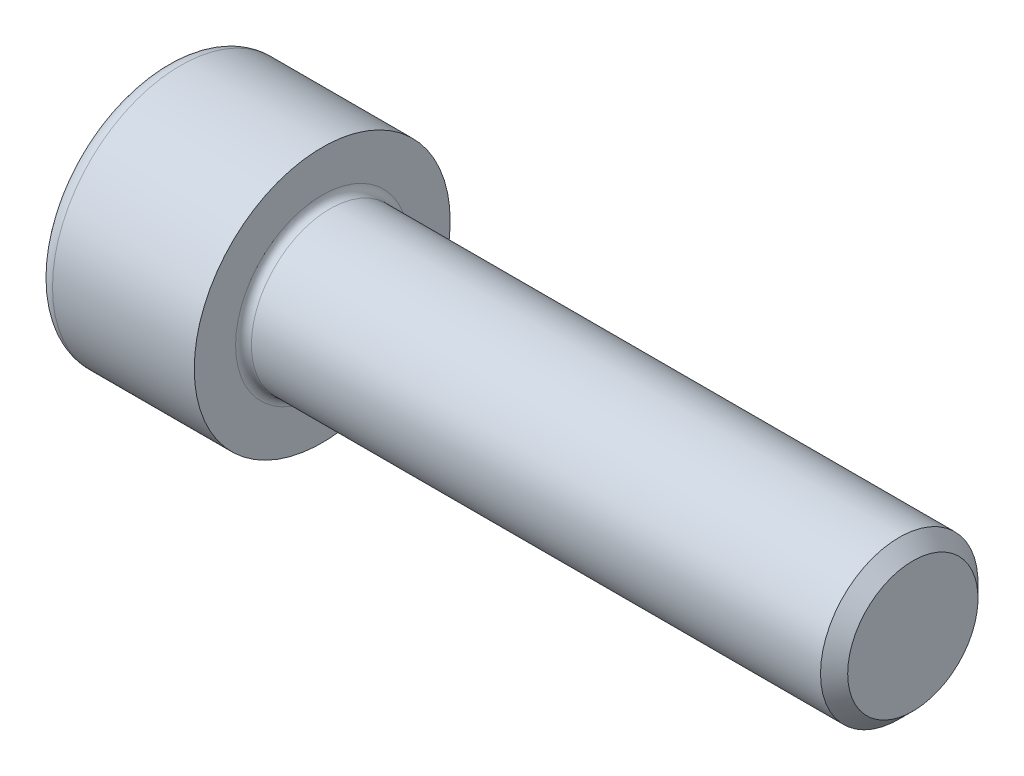
ISO-10303-21;
HEADER;
FILE_DESCRIPTION(('STEP AP214'),'2;1');
FILE_NAME('part.step','',(''),(''),'','','');
FILE_SCHEMA(('AUTOMOTIVE_DESIGN { 1 0 10303 214 1 1 1 1 }'));
ENDSEC;
DATA;
#1=APPLICATION_CONTEXT('core data for automotive mechanical design processes');
#2=APPLICATION_PROTOCOL_DEFINITION('international standard','automotive_design',2000,#1);
#3=PRODUCT_CONTEXT('',#1,'mechanical');
#4=PRODUCT('Part','Part','',(#3));
#5=PRODUCT_RELATED_PRODUCT_CATEGORY('part','',(#4));
#6=PRODUCT_DEFINITION_FORMATION('','',#4);
#7=PRODUCT_DEFINITION_CONTEXT('part definition',#1,'design');
#8=PRODUCT_DEFINITION('design','',#6,#7);
#9=PRODUCT_DEFINITION_SHAPE('','',#8);
#10=(LENGTH_UNIT() NAMED_UNIT(*) SI_UNIT(.MILLI.,.METRE.));
#11=(NAMED_UNIT(*) PLANE_ANGLE_UNIT() SI_UNIT($,.RADIAN.));
#12=(NAMED_UNIT(*) SI_UNIT($,.STERADIAN.) SOLID_ANGLE_UNIT());
#13=UNCERTAINTY_MEASURE_WITH_UNIT(LENGTH_MEASURE(1.E-05),#10,'distance_accuracy_value','');
#14=(GEOMETRIC_REPRESENTATION_CONTEXT(3) GLOBAL_UNCERTAINTY_ASSIGNED_CONTEXT((#13)) GLOBAL_UNIT_ASSIGNED_CONTEXT((#10,
#11,#12)) REPRESENTATION_CONTEXT('',''));
#15=CARTESIAN_POINT('',(0.,0.,0.));
#16=DIRECTION('',(0.,0.,1.));
#17=DIRECTION('',(1.,0.,0.));
#18=AXIS2_PLACEMENT_3D('',#15,#16,#17);
#19=CARTESIAN_POINT('',(3.99999999996226,0.,0.));
#20=DIRECTION('',(-1.,0.,0.));
#21=DIRECTION('',(0.,0.,1.));
#22=AXIS2_PLACEMENT_3D('',#19,#20,#21);
#23=CONICAL_SURFACE('',#22,3.00999999996066,1.04719755119748);
#24=CARTESIAN_POINT('',(5.73782431018799,0.,0.));
#25=VERTEX_POINT('',#24);
#26=VERTEX_LOOP('',#25);
#27=FACE_BOUND('',#26,.T.);
#28=CARTESIAN_POINT('',(3.99999999996226,0.,0.));
#29=DIRECTION('',(-1.,0.,0.));
#30=DIRECTION('',(0.,0.,1.));
#31=AXIS2_PLACEMENT_3D('',#28,#29,#30);
#32=CIRCLE('',#31,3.00999999996066);
#33=CARTESIAN_POINT('',(3.99999999998113,-2.60673646537412,1.50499999999017));
#34=VERTEX_POINT('',#33);
#35=CARTESIAN_POINT('',(3.99999999995748,0.,3.00999999999891));
#36=VERTEX_POINT('',#35);
#37=EDGE_CURVE('E102',#34,#36,#32,.T.);
#38=ORIENTED_EDGE('',*,*,#37,.T.);
#39=CARTESIAN_POINT('',(3.99999999996226,0.,0.));
#40=DIRECTION('',(-1.,0.,0.));
#41=DIRECTION('',(0.,0.,1.));
#42=AXIS2_PLACEMENT_3D('',#39,#40,#41);
#43=CIRCLE('',#42,3.00999999996066);
#44=CARTESIAN_POINT('',(3.99999999998113,2.60673646537412,1.50499999999016));
#45=VERTEX_POINT('',#44);
#46=EDGE_CURVE('E105',#36,#45,#43,.T.);
#47=ORIENTED_EDGE('',*,*,#46,.T.);
#48=CARTESIAN_POINT('',(3.99999999996226,0.,0.));
#49=DIRECTION('',(-1.,0.,0.));
#50=DIRECTION('',(0.,0.,1.));
#51=AXIS2_PLACEMENT_3D('',#48,#49,#50);
#52=CIRCLE('',#51,3.00999999996066);
#53=CARTESIAN_POINT('',(3.99999999998113,2.60673646537412,-1.50499999999017));
#54=VERTEX_POINT('',#53);
#55=EDGE_CURVE('E107',#45,#54,#52,.T.);
#56=ORIENTED_EDGE('',*,*,#55,.T.);
#57=CARTESIAN_POINT('',(3.99999999996226,0.,0.));
#58=DIRECTION('',(-1.,0.,0.));
#59=DIRECTION('',(0.,0.,1.));
#60=AXIS2_PLACEMENT_3D('',#57,#58,#59);
#61=CIRCLE('',#60,3.00999999996066);
#62=CARTESIAN_POINT('',(3.99999999995748,0.,-3.00999999999891));
#63=VERTEX_POINT('',#62);
#64=EDGE_CURVE('E121',#54,#63,#61,.T.);
#65=ORIENTED_EDGE('',*,*,#64,.T.);
#66=CARTESIAN_POINT('',(3.99999999996226,0.,0.));
#67=DIRECTION('',(-1.,0.,0.));
#68=DIRECTION('',(0.,0.,1.));
#69=AXIS2_PLACEMENT_3D('',#66,#67,#68);
#70=CIRCLE('',#69,3.00999999996065);
#71=CARTESIAN_POINT('',(3.99999999998113,-2.60673646537413,-1.50499999999016));
#72=VERTEX_POINT('',#71);
#73=EDGE_CURVE('E122',#63,#72,#70,.T.);
#74=ORIENTED_EDGE('',*,*,#73,.T.);
#75=CARTESIAN_POINT('',(3.99999999996226,0.,0.));
#76=DIRECTION('',(-1.,0.,0.));
#77=DIRECTION('',(0.,0.,1.));
#78=AXIS2_PLACEMENT_3D('',#75,#76,#77);
#79=CIRCLE('',#78,3.00999999996066);
#80=EDGE_CURVE('E230',#72,#34,#79,.T.);
#81=ORIENTED_EDGE('',*,*,#80,.T.);
#82=EDGE_LOOP('',(#38,#47,#56,#65,#74,#81));
#83=FACE_BOUND('',#82,.T.);
#84=ADVANCED_FACE('F17',(#27,#83),#23,.F.);
#85=CARTESIAN_POINT('',(4.,3.47564862052154,0.));
#86=DIRECTION('',(1.,0.,0.));
#87=DIRECTION('',(0.,0.,-1.));
#88=AXIS2_PLACEMENT_3D('',#85,#86,#87);
#89=PLANE('',#88);
#90=DIRECTION('',(0.,0.499999999999999,-0.866025403784439));
#91=VECTOR('',#90,1.);
#92=CARTESIAN_POINT('',(4.,3.47564862052154,0.));
#93=LINE('',#92,#91);
#94=CARTESIAN_POINT('',(4.,1.73782431026077,3.01));
#95=VERTEX_POINT('',#94);
#96=EDGE_CURVE('E125',#45,#95,#93,.F.);
#97=ORIENTED_EDGE('',*,*,#96,.F.);
#98=ORIENTED_EDGE('',*,*,#46,.F.);
#99=DIRECTION('',(0.,-1.,0.));
#100=VECTOR('',#99,1.);
#101=CARTESIAN_POINT('',(4.,-1.73782431026077,3.01));
#102=LINE('',#101,#100);
#103=EDGE_CURVE('E127',#36,#95,#102,.F.);
#104=ORIENTED_EDGE('',*,*,#103,.T.);
#105=EDGE_LOOP('',(#97,#98,#104));
#106=FACE_BOUND('',#105,.T.);
#107=ADVANCED_FACE('F126',(#106),#89,.F.);
#108=CARTESIAN_POINT('',(4.,3.47564862052154,0.));
#109=DIRECTION('',(1.,0.,0.));
#110=DIRECTION('',(0.,0.,-1.));
#111=AXIS2_PLACEMENT_3D('',#108,#109,#110);
#112=PLANE('',#111);
#113=DIRECTION('',(0.,-1.,0.));
#114=VECTOR('',#113,1.);
#115=CARTESIAN_POINT('',(4.,-1.73782431026077,3.01));
#116=LINE('',#115,#114);
#117=CARTESIAN_POINT('',(4.,-1.73782431026077,3.01));
#118=VERTEX_POINT('',#117);
#119=EDGE_CURVE('E130',#118,#36,#116,.F.);
#120=ORIENTED_EDGE('',*,*,#119,.T.);
#121=ORIENTED_EDGE('',*,*,#37,.F.);
#122=DIRECTION('',(0.,0.500000000000001,0.866025403784438));
#123=VECTOR('',#122,1.);
#124=CARTESIAN_POINT('',(4.,-1.73782431026077,3.01));
#125=LINE('',#124,#123);
#126=EDGE_CURVE('E183',#118,#34,#125,.F.);
#127=ORIENTED_EDGE('',*,*,#126,.F.);
#128=EDGE_LOOP('',(#120,#121,#127));
#129=FACE_BOUND('',#128,.T.);
#130=ADVANCED_FACE('F490',(#129),#112,.F.);
#131=CARTESIAN_POINT('',(4.,3.47564862052154,0.));
#132=DIRECTION('',(1.,0.,0.));
#133=DIRECTION('',(0.,0.,-1.));
#134=AXIS2_PLACEMENT_3D('',#131,#132,#133);
#135=PLANE('',#134);
#136=DIRECTION('',(0.,0.500000000000001,0.866025403784438));
#137=VECTOR('',#136,1.);
#138=CARTESIAN_POINT('',(4.,-1.73782431026077,3.01));
#139=LINE('',#138,#137);
#140=CARTESIAN_POINT('',(4.,-3.47564862052155,0.));
#141=VERTEX_POINT('',#140);
#142=EDGE_CURVE('E179',#34,#141,#139,.F.);
#143=ORIENTED_EDGE('',*,*,#142,.F.);
#144=ORIENTED_EDGE('',*,*,#80,.F.);
#145=DIRECTION('',(0.,-0.499999999999999,0.866025403784439));
#146=VECTOR('',#145,1.);
#147=CARTESIAN_POINT('',(4.,-3.47564862052155,0.));
#148=LINE('',#147,#146);
#149=EDGE_CURVE('E166',#141,#72,#148,.F.);
#150=ORIENTED_EDGE('',*,*,#149,.F.);
#151=EDGE_LOOP('',(#143,#144,#150));
#152=FACE_BOUND('',#151,.T.);
#153=ADVANCED_FACE('F482',(#152),#135,.F.);
#154=CARTESIAN_POINT('',(4.,3.47564862052154,0.));
#155=DIRECTION('',(1.,0.,0.));
#156=DIRECTION('',(0.,0.,-1.));
#157=AXIS2_PLACEMENT_3D('',#154,#155,#156);
#158=PLANE('',#157);
#159=DIRECTION('',(0.,-0.499999999999999,0.866025403784439));
#160=VECTOR('',#159,1.);
#161=CARTESIAN_POINT('',(4.,-3.47564862052155,0.));
#162=LINE('',#161,#160);
#163=CARTESIAN_POINT('',(4.,-1.73782431026078,-3.01));
#164=VERTEX_POINT('',#163);
#165=EDGE_CURVE('E163',#72,#164,#162,.F.);
#166=ORIENTED_EDGE('',*,*,#165,.F.);
#167=ORIENTED_EDGE('',*,*,#73,.F.);
#168=DIRECTION('',(0.,1.,0.));
#169=VECTOR('',#168,1.);
#170=CARTESIAN_POINT('',(4.,1.73782431026076,-3.01));
#171=LINE('',#170,#169);
#172=EDGE_CURVE('E157',#63,#164,#171,.F.);
#173=ORIENTED_EDGE('',*,*,#172,.T.);
#174=EDGE_LOOP('',(#166,#167,#173));
#175=FACE_BOUND('',#174,.T.);
#176=ADVANCED_FACE('F475',(#175),#158,.F.);
#177=CARTESIAN_POINT('',(4.,3.47564862052154,0.));
#178=DIRECTION('',(1.,0.,0.));
#179=DIRECTION('',(0.,0.,-1.));
#180=AXIS2_PLACEMENT_3D('',#177,#178,#179);
#181=PLANE('',#180);
#182=DIRECTION('',(0.,0.500000000000001,0.866025403784438));
#183=VECTOR('',#182,1.);
#184=CARTESIAN_POINT('',(4.,3.47564862052154,0.));
#185=LINE('',#184,#183);
#186=CARTESIAN_POINT('',(4.,3.47564862052154,0.));
#187=VERTEX_POINT('',#186);
#188=EDGE_CURVE('E119',#187,#54,#185,.F.);
#189=ORIENTED_EDGE('',*,*,#188,.T.);
#190=ORIENTED_EDGE('',*,*,#55,.F.);
#191=DIRECTION('',(0.,0.499999999999999,-0.866025403784439));
#192=VECTOR('',#191,1.);
#193=CARTESIAN_POINT('',(4.,3.47564862052154,0.));
#194=LINE('',#193,#192);
#195=EDGE_CURVE('E116',#187,#45,#194,.F.);
#196=ORIENTED_EDGE('',*,*,#195,.F.);
#197=EDGE_LOOP('',(#189,#190,#196));
#198=FACE_BOUND('',#197,.T.);
#199=ADVANCED_FACE('F114',(#198),#181,.F.);
#200=CARTESIAN_POINT('',(4.,3.47564862052154,0.));
#201=DIRECTION('',(1.,0.,0.));
#202=DIRECTION('',(0.,0.,-1.));
#203=AXIS2_PLACEMENT_3D('',#200,#201,#202);
#204=PLANE('',#203);
#205=DIRECTION('',(0.,1.,0.));
#206=VECTOR('',#205,1.);
#207=CARTESIAN_POINT('',(4.,1.73782431026076,-3.01));
#208=LINE('',#207,#206);
#209=CARTESIAN_POINT('',(4.,1.73782431026077,-3.01));
#210=VERTEX_POINT('',#209);
#211=EDGE_CURVE('E160',#210,#63,#208,.F.);
#212=ORIENTED_EDGE('',*,*,#211,.T.);
#213=ORIENTED_EDGE('',*,*,#64,.F.);
#214=DIRECTION('',(0.,0.500000000000001,0.866025403784438));
#215=VECTOR('',#214,1.);
#216=CARTESIAN_POINT('',(4.,3.47564862052154,0.));
#217=LINE('',#216,#215);
#218=EDGE_CURVE('E317',#54,#210,#217,.F.);
#219=ORIENTED_EDGE('',*,*,#218,.T.);
#220=EDGE_LOOP('',(#212,#213,#219));
#221=FACE_BOUND('',#220,.T.);
#222=ADVANCED_FACE('F461',(#221),#204,.F.);
#223=CARTESIAN_POINT('',(4.,3.47564862052154,0.));
#224=DIRECTION('',(0.,-0.866025403784439,-0.499999999999999));
#225=DIRECTION('',(0.,0.499999999999999,-0.866025403784439));
#226=AXIS2_PLACEMENT_3D('',#223,#224,#225);
#227=PLANE('',#226);
#228=ORIENTED_EDGE('',*,*,#96,.T.);
#229=DIRECTION('',(1.,0.,0.));
#230=VECTOR('',#229,1.);
#231=CARTESIAN_POINT('',(4.,1.73782431026077,3.01));
#232=LINE('',#231,#230);
#233=CARTESIAN_POINT('',(0.,1.73782431026077,3.01));
#234=VERTEX_POINT('',#233);
#235=EDGE_CURVE('E203',#95,#234,#232,.F.);
#236=ORIENTED_EDGE('',*,*,#235,.T.);
#237=DIRECTION('',(0.,-0.499999999999999,0.866025403784439));
#238=VECTOR('',#237,1.);
#239=CARTESIAN_POINT('',(0.,3.47564862052154,0.));
#240=LINE('',#239,#238);
#241=CARTESIAN_POINT('',(0.,3.47564862052154,0.));
#242=VERTEX_POINT('',#241);
#243=EDGE_CURVE('E143',#242,#234,#240,.T.);
#244=ORIENTED_EDGE('',*,*,#243,.F.);
#245=DIRECTION('',(1.,0.,0.));
#246=VECTOR('',#245,1.);
#247=CARTESIAN_POINT('',(4.,3.47564862052154,0.));
#248=LINE('',#247,#246);
#249=EDGE_CURVE('E134',#242,#187,#248,.T.);
#250=ORIENTED_EDGE('',*,*,#249,.T.);
#251=ORIENTED_EDGE('',*,*,#195,.T.);
#252=EDGE_LOOP('',(#228,#236,#244,#250,#251));
#253=FACE_BOUND('',#252,.T.);
#254=ADVANCED_FACE('F132',(#253),#227,.T.);
#255=CARTESIAN_POINT('',(4.,-1.73782431026077,3.01));
#256=DIRECTION('',(0.,0.,1.));
#257=DIRECTION('',(0.,-1.,0.));
#258=AXIS2_PLACEMENT_3D('',#255,#256,#257);
#259=PLANE('',#258);
#260=ORIENTED_EDGE('',*,*,#235,.F.);
#261=ORIENTED_EDGE('',*,*,#103,.F.);
#262=ORIENTED_EDGE('',*,*,#119,.F.);
#263=DIRECTION('',(1.,0.,0.));
#264=VECTOR('',#263,1.);
#265=CARTESIAN_POINT('',(4.,-1.73782431026077,3.01));
#266=LINE('',#265,#264);
#267=CARTESIAN_POINT('',(0.,-1.73782431026077,3.01));
#268=VERTEX_POINT('',#267);
#269=EDGE_CURVE('E198',#268,#118,#266,.T.);
#270=ORIENTED_EDGE('',*,*,#269,.F.);
#271=DIRECTION('',(0.,1.,0.));
#272=VECTOR('',#271,1.);
#273=CARTESIAN_POINT('',(0.,0.,3.01));
#274=LINE('',#273,#272);
#275=EDGE_CURVE('E146',#234,#268,#274,.F.);
#276=ORIENTED_EDGE('',*,*,#275,.F.);
#277=EDGE_LOOP('',(#260,#261,#262,#270,#276));
#278=FACE_BOUND('',#277,.T.);
#279=ADVANCED_FACE('F446',(#278),#259,.F.);
#280=CARTESIAN_POINT('',(4.,-1.73782431026077,3.01));
#281=DIRECTION('',(0.,0.866025403784438,-0.500000000000001));
#282=DIRECTION('',(0.,0.500000000000001,0.866025403784438));
#283=AXIS2_PLACEMENT_3D('',#280,#281,#282);
#284=PLANE('',#283);
#285=ORIENTED_EDGE('',*,*,#142,.T.);
#286=DIRECTION('',(1.,0.,0.));
#287=VECTOR('',#286,1.);
#288=CARTESIAN_POINT('',(4.,-3.47564862052155,0.));
#289=LINE('',#288,#287);
#290=CARTESIAN_POINT('',(0.,-3.47564862052155,0.));
#291=VERTEX_POINT('',#290);
#292=EDGE_CURVE('E174',#291,#141,#289,.T.);
#293=ORIENTED_EDGE('',*,*,#292,.F.);
#294=DIRECTION('',(0.,-0.500000000000001,-0.866025403784438));
#295=VECTOR('',#294,1.);
#296=CARTESIAN_POINT('',(0.,-1.73782431026077,3.01));
#297=LINE('',#296,#295);
#298=EDGE_CURVE('E189',#268,#291,#297,.T.);
#299=ORIENTED_EDGE('',*,*,#298,.F.);
#300=ORIENTED_EDGE('',*,*,#269,.T.);
#301=ORIENTED_EDGE('',*,*,#126,.T.);
#302=EDGE_LOOP('',(#285,#293,#299,#300,#301));
#303=FACE_BOUND('',#302,.T.);
#304=ADVANCED_FACE('F438',(#303),#284,.T.);
#305=CARTESIAN_POINT('',(4.,-3.47564862052155,0.));
#306=DIRECTION('',(0.,0.866025403784439,0.499999999999999));
#307=DIRECTION('',(0.,-0.499999999999999,0.866025403784439));
#308=AXIS2_PLACEMENT_3D('',#305,#306,#307);
#309=PLANE('',#308);
#310=ORIENTED_EDGE('',*,*,#165,.T.);
#311=DIRECTION('',(1.,0.,0.));
#312=VECTOR('',#311,1.);
#313=CARTESIAN_POINT('',(4.,-1.73782431026078,-3.01));
#314=LINE('',#313,#312);
#315=CARTESIAN_POINT('',(0.,-1.73782431026078,-3.01));
#316=VERTEX_POINT('',#315);
#317=EDGE_CURVE('E159',#164,#316,#314,.F.);
#318=ORIENTED_EDGE('',*,*,#317,.T.);
#319=DIRECTION('',(0.,0.499999999999999,-0.866025403784439));
#320=VECTOR('',#319,1.);
#321=CARTESIAN_POINT('',(0.,-3.47564862052155,0.));
#322=LINE('',#321,#320);
#323=EDGE_CURVE('E186',#291,#316,#322,.T.);
#324=ORIENTED_EDGE('',*,*,#323,.F.);
#325=ORIENTED_EDGE('',*,*,#292,.T.);
#326=ORIENTED_EDGE('',*,*,#149,.T.);
#327=EDGE_LOOP('',(#310,#318,#324,#325,#326));
#328=FACE_BOUND('',#327,.T.);
#329=ADVANCED_FACE('F431',(#328),#309,.T.);
#330=CARTESIAN_POINT('',(4.,1.73782431026076,-3.01));
#331=DIRECTION('',(0.,0.,-1.));
#332=DIRECTION('',(0.,1.,0.));
#333=AXIS2_PLACEMENT_3D('',#330,#331,#332);
#334=PLANE('',#333);
#335=ORIENTED_EDGE('',*,*,#317,.F.);
#336=ORIENTED_EDGE('',*,*,#172,.F.);
#337=ORIENTED_EDGE('',*,*,#211,.F.);
#338=DIRECTION('',(1.,0.,0.));
#339=VECTOR('',#338,1.);
#340=CARTESIAN_POINT('',(4.,1.73782431026076,-3.01));
#341=LINE('',#340,#339);
#342=CARTESIAN_POINT('',(0.,1.73782431026077,-3.01));
#343=VERTEX_POINT('',#342);
#344=EDGE_CURVE('E147',#210,#343,#341,.F.);
#345=ORIENTED_EDGE('',*,*,#344,.T.);
#346=DIRECTION('',(0.,1.,0.));
#347=VECTOR('',#346,1.);
#348=CARTESIAN_POINT('',(0.,0.,-3.01));
#349=LINE('',#348,#347);
#350=EDGE_CURVE('E154',#316,#343,#349,.T.);
#351=ORIENTED_EDGE('',*,*,#350,.F.);
#352=EDGE_LOOP('',(#335,#336,#337,#345,#351));
#353=FACE_BOUND('',#352,.T.);
#354=ADVANCED_FACE('F335',(#353),#334,.F.);
#355=CARTESIAN_POINT('',(4.,3.47564862052154,0.));
#356=DIRECTION('',(0.,0.866025403784438,-0.500000000000001));
#357=DIRECTION('',(0.,0.500000000000001,0.866025403784438));
#358=AXIS2_PLACEMENT_3D('',#355,#356,#357);
#359=PLANE('',#358);
#360=ORIENTED_EDGE('',*,*,#344,.F.);
#361=ORIENTED_EDGE('',*,*,#218,.F.);
#362=ORIENTED_EDGE('',*,*,#188,.F.);
#363=ORIENTED_EDGE('',*,*,#249,.F.);
#364=DIRECTION('',(0.,0.500000000000001,0.866025403784438));
#365=VECTOR('',#364,1.);
#366=CARTESIAN_POINT('',(0.,1.73782431026076,-3.01));
#367=LINE('',#366,#365);
#368=EDGE_CURVE('E150',#343,#242,#367,.T.);
#369=ORIENTED_EDGE('',*,*,#368,.F.);
#370=EDGE_LOOP('',(#360,#361,#362,#363,#369));
#371=FACE_BOUND('',#370,.T.);
#372=ADVANCED_FACE('F340',(#371),#359,.F.);
#373=CARTESIAN_POINT('',(0.,0.,0.));
#374=DIRECTION('',(-1.,0.,0.));
#375=DIRECTION('',(0.,0.,1.));
#376=AXIS2_PLACEMENT_3D('',#373,#374,#375);
#377=PLANE('',#376);
#378=CARTESIAN_POINT('',(0.,0.,0.));
#379=DIRECTION('',(1.,0.,0.));
#380=DIRECTION('',(0.,0.,-1.));
#381=AXIS2_PLACEMENT_3D('',#378,#379,#380);
#382=CIRCLE('',#381,5.7);
#383=CARTESIAN_POINT('',(0.,0.,-5.7));
#384=VERTEX_POINT('',#383);
#385=CARTESIAN_POINT('',(0.,0.,5.7));
#386=VERTEX_POINT('',#385);
#387=EDGE_CURVE('E153',#384,#386,#382,.T.);
#388=ORIENTED_EDGE('',*,*,#387,.F.);
#389=CARTESIAN_POINT('',(0.,0.,0.));
#390=DIRECTION('',(1.,0.,0.));
#391=DIRECTION('',(0.,0.,1.));
#392=AXIS2_PLACEMENT_3D('',#389,#390,#391);
#393=CIRCLE('',#392,5.7);
#394=EDGE_CURVE('E355',#386,#384,#393,.T.);
#395=ORIENTED_EDGE('',*,*,#394,.F.);
#396=EDGE_LOOP('',(#388,#395));
#397=FACE_BOUND('',#396,.T.);
#398=ORIENTED_EDGE('',*,*,#350,.T.);
#399=ORIENTED_EDGE('',*,*,#368,.T.);
#400=ORIENTED_EDGE('',*,*,#243,.T.);
#401=ORIENTED_EDGE('',*,*,#275,.T.);
#402=ORIENTED_EDGE('',*,*,#298,.T.);
#403=ORIENTED_EDGE('',*,*,#323,.T.);
#404=EDGE_LOOP('',(#398,#399,#400,#401,#402,#403));
#405=FACE_BOUND('',#404,.T.);
#406=ADVANCED_FACE('F299',(#397,#405),#377,.T.);
#407=CARTESIAN_POINT('',(0.800000000000002,0.,0.));
#408=DIRECTION('',(-1.,0.,0.));
#409=DIRECTION('',(0.,0.,1.));
#410=AXIS2_PLACEMENT_3D('',#407,#408,#409);
#411=TOROIDAL_SURFACE('',#410,5.7,0.8);
#412=CARTESIAN_POINT('',(0.800000000000002,0.,0.));
#413=DIRECTION('',(-1.,0.,0.));
#414=DIRECTION('',(0.,0.,1.));
#415=AXIS2_PLACEMENT_3D('',#412,#413,#414);
#416=CIRCLE('',#415,6.5);
#417=CARTESIAN_POINT('',(0.800000000000002,0.,6.5));
#418=VERTEX_POINT('',#417);
#419=EDGE_CURVE('E227',#418,#418,#416,.F.);
#420=ORIENTED_EDGE('',*,*,#419,.F.);
#421=EDGE_LOOP('',(#420));
#422=FACE_BOUND('',#421,.T.);
#423=ORIENTED_EDGE('',*,*,#394,.T.);
#424=ORIENTED_EDGE('',*,*,#387,.T.);
#425=EDGE_LOOP('',(#423,#424));
#426=FACE_BOUND('',#425,.T.);
#427=ADVANCED_FACE('F294',(#422,#426),#411,.T.);
#428=CARTESIAN_POINT('',(-31.75,0.,0.));
#429=DIRECTION('',(-1.,0.,0.));
#430=DIRECTION('',(0.,0.,1.));
#431=AXIS2_PLACEMENT_3D('',#428,#429,#430);
#432=CYLINDRICAL_SURFACE('',#431,6.5);
#433=CARTESIAN_POINT('',(8.,0.,0.));
#434=DIRECTION('',(-1.,0.,0.));
#435=DIRECTION('',(0.,0.,1.));
#436=AXIS2_PLACEMENT_3D('',#433,#434,#435);
#437=CIRCLE('',#436,6.5);
#438=CARTESIAN_POINT('',(8.,0.,6.5));
#439=VERTEX_POINT('',#438);
#440=EDGE_CURVE('E225',#439,#439,#437,.F.);
#441=ORIENTED_EDGE('',*,*,#440,.F.);
#442=EDGE_LOOP('',(#441));
#443=FACE_BOUND('',#442,.T.);
#444=ORIENTED_EDGE('',*,*,#419,.T.);
#445=EDGE_LOOP('',(#444));
#446=FACE_BOUND('',#445,.T.);
#447=ADVANCED_FACE('F298',(#443,#446),#432,.T.);
#448=CARTESIAN_POINT('',(38.,3.3095,0.));
#449=DIRECTION('',(1.,0.,0.));
#450=DIRECTION('',(0.,0.,-1.));
#451=AXIS2_PLACEMENT_3D('',#448,#449,#450);
#452=PLANE('',#451);
#453=CARTESIAN_POINT('',(37.9999999999541,0.,0.));
#454=DIRECTION('',(-1.,0.,0.));
#455=DIRECTION('',(0.,0.,1.));
#456=AXIS2_PLACEMENT_3D('',#453,#454,#455);
#457=CIRCLE('',#456,3.30950000005714);
#458=CARTESIAN_POINT('',(37.9999999999541,0.,3.30950000005714));
#459=VERTEX_POINT('',#458);
#460=EDGE_CURVE('E221',#459,#459,#457,.T.);
#461=ORIENTED_EDGE('',*,*,#460,.F.);
#462=EDGE_LOOP('',(#461));
#463=FACE_BOUND('',#462,.T.);
#464=ADVANCED_FACE('F271',(#463),#452,.T.);
#465=CARTESIAN_POINT('',(8.,6.5,0.));
#466=DIRECTION('',(1.,0.,0.));
#467=DIRECTION('',(0.,0.,-1.));
#468=AXIS2_PLACEMENT_3D('',#465,#466,#467);
#469=PLANE('',#468);
#470=ORIENTED_EDGE('',*,*,#440,.T.);
#471=EDGE_LOOP('',(#470));
#472=FACE_BOUND('',#471,.T.);
#473=CARTESIAN_POINT('',(8.,0.,0.));
#474=DIRECTION('',(1.,0.,0.));
#475=DIRECTION('',(0.,0.,1.));
#476=AXIS2_PLACEMENT_3D('',#473,#474,#475);
#477=CIRCLE('',#476,4.39999999999999);
#478=CARTESIAN_POINT('',(8.,0.,-4.39999999999999));
#479=VERTEX_POINT('',#478);
#480=CARTESIAN_POINT('',(8.,0.,4.39999999999999));
#481=VERTEX_POINT('',#480);
#482=EDGE_CURVE('E224',#479,#481,#477,.F.);
#483=ORIENTED_EDGE('',*,*,#482,.T.);
#484=CARTESIAN_POINT('',(8.,0.,0.));
#485=DIRECTION('',(1.,0.,0.));
#486=DIRECTION('',(0.,0.,-1.));
#487=AXIS2_PLACEMENT_3D('',#484,#485,#486);
#488=CIRCLE('',#487,4.39999999999999);
#489=EDGE_CURVE('E36',#481,#479,#488,.F.);
#490=ORIENTED_EDGE('',*,*,#489,.T.);
#491=EDGE_LOOP('',(#483,#490));
#492=FACE_BOUND('',#491,.T.);
#493=ADVANCED_FACE('F262',(#472,#492),#469,.T.);
#494=CARTESIAN_POINT('',(37.3094999999921,0.,0.));
#495=DIRECTION('',(-1.,0.,0.));
#496=DIRECTION('',(0.,0.,1.));
#497=AXIS2_PLACEMENT_3D('',#494,#495,#496);
#498=CONICAL_SURFACE('',#497,4.0000000000191,0.785398163397448);
#499=CARTESIAN_POINT('',(37.3095,0.,0.));
#500=DIRECTION('',(-1.,0.,0.));
#501=DIRECTION('',(0.,0.,1.));
#502=AXIS2_PLACEMENT_3D('',#499,#500,#501);
#503=CIRCLE('',#502,3.99999999999999);
#504=CARTESIAN_POINT('',(37.3095,0.,3.99999999999999));
#505=VERTEX_POINT('',#504);
#506=EDGE_CURVE('E28',#505,#505,#503,.T.);
#507=ORIENTED_EDGE('',*,*,#506,.F.);
#508=EDGE_LOOP('',(#507));
#509=FACE_BOUND('',#508,.T.);
#510=ORIENTED_EDGE('',*,*,#460,.T.);
#511=EDGE_LOOP('',(#510));
#512=FACE_BOUND('',#511,.T.);
#513=ADVANCED_FACE('F250',(#509,#512),#498,.T.);
#514=CARTESIAN_POINT('',(8.4,0.,0.));
#515=DIRECTION('',(1.,0.,0.));
#516=DIRECTION('',(0.,0.,-1.));
#517=AXIS2_PLACEMENT_3D('',#514,#515,#516);
#518=TOROIDAL_SURFACE('',#517,4.39999999999999,0.4);
#519=CARTESIAN_POINT('',(8.4,0.,0.));
#520=DIRECTION('',(-1.,0.,0.));
#521=DIRECTION('',(0.,0.,1.));
#522=AXIS2_PLACEMENT_3D('',#519,#520,#521);
#523=CIRCLE('',#522,3.99999999999999);
#524=CARTESIAN_POINT('',(8.4,0.,3.99999999999999));
#525=VERTEX_POINT('',#524);
#526=EDGE_CURVE('E11',#525,#525,#523,.F.);
#527=ORIENTED_EDGE('',*,*,#526,.F.);
#528=EDGE_LOOP('',(#527));
#529=FACE_BOUND('',#528,.T.);
#530=ORIENTED_EDGE('',*,*,#482,.F.);
#531=ORIENTED_EDGE('',*,*,#489,.F.);
#532=EDGE_LOOP('',(#530,#531));
#533=FACE_BOUND('',#532,.T.);
#534=ADVANCED_FACE('F238',(#529,#533),#518,.F.);
#535=CARTESIAN_POINT('',(-31.75,0.,0.));
#536=DIRECTION('',(-1.,0.,0.));
#537=DIRECTION('',(0.,0.,1.));
#538=AXIS2_PLACEMENT_3D('',#535,#536,#537);
#539=CYLINDRICAL_SURFACE('',#538,3.99999999999999);
#540=ORIENTED_EDGE('',*,*,#526,.T.);
#541=EDGE_LOOP('',(#540));
#542=FACE_BOUND('',#541,.T.);
#543=ORIENTED_EDGE('',*,*,#506,.T.);
#544=EDGE_LOOP('',(#543));
#545=FACE_BOUND('',#544,.T.);
#546=ADVANCED_FACE('F249',(#542,#545),#539,.T.);
#547=CLOSED_SHELL('',(#84,#107,#130,#153,#176,#199,#222,#254,#279,#304,#329,#354,#372,#406,#427,
#447,#464,#493,#513,#534,#546));
#548=MANIFOLD_SOLID_BREP('B1',#547);
#549=ADVANCED_BREP_SHAPE_REPRESENTATION('',(#18,#548),#14);
#550=SHAPE_DEFINITION_REPRESENTATION(#9,#549);
ENDSEC;
END-ISO-10303-21;
